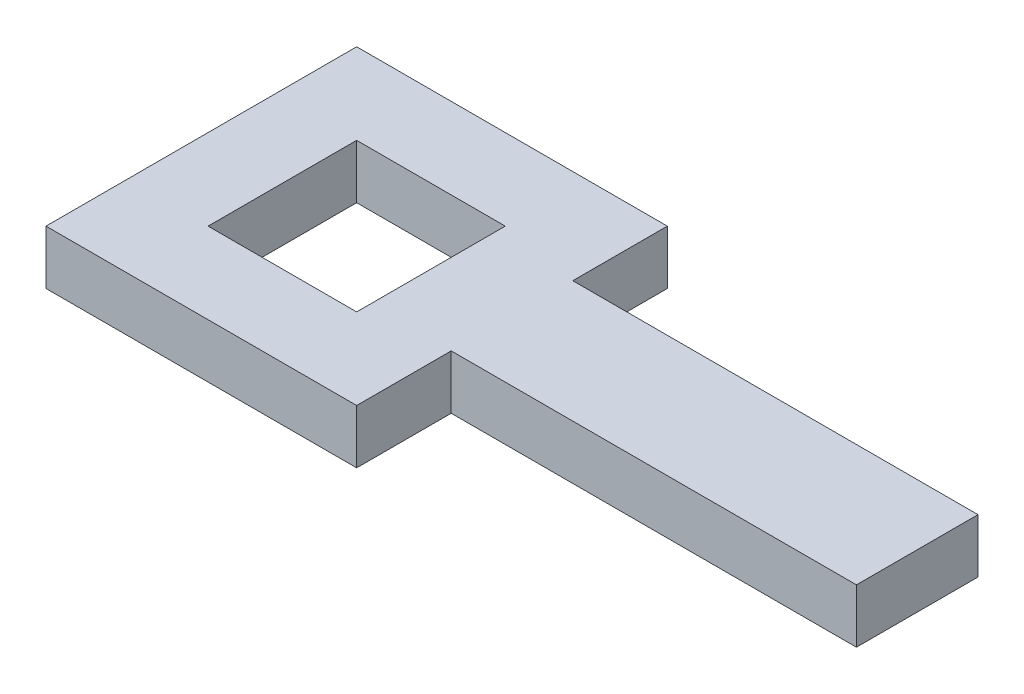
ISO-10303-21;
HEADER;
FILE_DESCRIPTION(('STEP AP214'),'2;1');
FILE_NAME('part.step','',(''),(''),'','','');
FILE_SCHEMA(('AUTOMOTIVE_DESIGN { 1 0 10303 214 1 1 1 1 }'));
ENDSEC;
DATA;
#1=APPLICATION_CONTEXT('core data for automotive mechanical design processes');
#2=APPLICATION_PROTOCOL_DEFINITION('international standard','automotive_design',2000,#1);
#3=PRODUCT_CONTEXT('',#1,'mechanical');
#4=PRODUCT('Part','Part','',(#3));
#5=PRODUCT_RELATED_PRODUCT_CATEGORY('part','',(#4));
#6=PRODUCT_DEFINITION_FORMATION('','',#4);
#7=PRODUCT_DEFINITION_CONTEXT('part definition',#1,'design');
#8=PRODUCT_DEFINITION('design','',#6,#7);
#9=PRODUCT_DEFINITION_SHAPE('','',#8);
#10=(LENGTH_UNIT() NAMED_UNIT(*) SI_UNIT(.MILLI.,.METRE.));
#11=(NAMED_UNIT(*) PLANE_ANGLE_UNIT() SI_UNIT($,.RADIAN.));
#12=(NAMED_UNIT(*) SI_UNIT($,.STERADIAN.) SOLID_ANGLE_UNIT());
#13=UNCERTAINTY_MEASURE_WITH_UNIT(LENGTH_MEASURE(1.E-05),#10,'distance_accuracy_value','');
#14=(GEOMETRIC_REPRESENTATION_CONTEXT(3) GLOBAL_UNCERTAINTY_ASSIGNED_CONTEXT((#13)) GLOBAL_UNIT_ASSIGNED_CONTEXT((#10,
#11,#12)) REPRESENTATION_CONTEXT('',''));
#15=CARTESIAN_POINT('',(0.,0.,0.));
#16=DIRECTION('',(0.,0.,1.));
#17=DIRECTION('',(1.,0.,0.));
#18=AXIS2_PLACEMENT_3D('',#15,#16,#17);
#19=CARTESIAN_POINT('',(11.1811881188119,4.,-11.7277227722772));
#20=DIRECTION('',(-1.,0.,0.));
#21=DIRECTION('',(0.,0.,1.));
#22=AXIS2_PLACEMENT_3D('',#19,#20,#21);
#23=PLANE('',#22);
#24=DIRECTION('',(0.,-1.,0.));
#25=VECTOR('',#24,1.);
#26=CARTESIAN_POINT('',(11.1811881188119,4.,4.27227722772277));
#27=LINE('',#26,#25);
#28=CARTESIAN_POINT('',(11.1811881188119,4.,4.27227722772277));
#29=VERTEX_POINT('',#28);
#30=CARTESIAN_POINT('',(11.1811881188119,0.,4.27227722772277));
#31=VERTEX_POINT('',#30);
#32=EDGE_CURVE('E61',#29,#31,#27,.T.);
#33=ORIENTED_EDGE('',*,*,#32,.F.);
#34=DIRECTION('',(0.,0.,-1.));
#35=VECTOR('',#34,1.);
#36=CARTESIAN_POINT('',(11.1811881188119,4.,-11.7277227722772));
#37=LINE('',#36,#35);
#38=CARTESIAN_POINT('',(11.1811881188119,4.,11.2722772277228));
#39=VERTEX_POINT('',#38);
#40=EDGE_CURVE('E222',#39,#29,#37,.T.);
#41=ORIENTED_EDGE('',*,*,#40,.F.);
#42=DIRECTION('',(0.,-1.,0.));
#43=VECTOR('',#42,1.);
#44=CARTESIAN_POINT('',(11.1811881188119,4.,11.2722772277228));
#45=LINE('',#44,#43);
#46=CARTESIAN_POINT('',(11.1811881188119,0.,11.2722772277228));
#47=VERTEX_POINT('',#46);
#48=EDGE_CURVE('E54',#39,#47,#45,.T.);
#49=ORIENTED_EDGE('',*,*,#48,.T.);
#50=DIRECTION('',(0.,0.,-1.));
#51=VECTOR('',#50,1.);
#52=CARTESIAN_POINT('',(11.1811881188119,0.,-11.7277227722772));
#53=LINE('',#52,#51);
#54=EDGE_CURVE('E236',#47,#31,#53,.T.);
#55=ORIENTED_EDGE('',*,*,#54,.T.);
#56=EDGE_LOOP('',(#33,#41,#49,#55));
#57=FACE_BOUND('',#56,.T.);
#58=ADVANCED_FACE('F45',(#57),#23,.F.);
#59=DIRECTION('',(0.,1.,0.));
#60=VECTOR('',#59,1.);
#61=CARTESIAN_POINT('',(11.1811881188119,4.,-4.72772277227723));
#62=LINE('',#61,#60);
#63=CARTESIAN_POINT('',(11.1811881188119,0.,-4.72772277227723));
#64=VERTEX_POINT('',#63);
#65=CARTESIAN_POINT('',(11.1811881188119,4.,-4.72772277227723));
#66=VERTEX_POINT('',#65);
#67=EDGE_CURVE('E69',#64,#66,#62,.T.);
#68=ORIENTED_EDGE('',*,*,#67,.F.);
#69=CARTESIAN_POINT('',(11.1811881188119,0.,-11.7277227722772));
#70=VERTEX_POINT('',#69);
#71=EDGE_CURVE('E235',#64,#70,#53,.T.);
#72=ORIENTED_EDGE('',*,*,#71,.T.);
#73=DIRECTION('',(0.,-1.,0.));
#74=VECTOR('',#73,1.);
#75=CARTESIAN_POINT('',(11.1811881188119,4.,-11.7277227722772));
#76=LINE('',#75,#74);
#77=CARTESIAN_POINT('',(11.1811881188119,4.,-11.7277227722772));
#78=VERTEX_POINT('',#77);
#79=EDGE_CURVE('E244',#78,#70,#76,.T.);
#80=ORIENTED_EDGE('',*,*,#79,.F.);
#81=EDGE_CURVE('E221',#66,#78,#37,.T.);
#82=ORIENTED_EDGE('',*,*,#81,.F.);
#83=EDGE_LOOP('',(#68,#72,#80,#82));
#84=FACE_BOUND('',#83,.T.);
#85=ADVANCED_FACE('F281',(#84),#23,.F.);
#86=CARTESIAN_POINT('',(-11.8188118811881,4.,-11.7277227722772));
#87=DIRECTION('',(1.,0.,0.));
#88=DIRECTION('',(0.,0.,-1.));
#89=AXIS2_PLACEMENT_3D('',#86,#87,#88);
#90=PLANE('',#89);
#91=DIRECTION('',(0.,0.,1.));
#92=VECTOR('',#91,1.);
#93=CARTESIAN_POINT('',(-11.8188118811881,0.,-11.7277227722772));
#94=LINE('',#93,#92);
#95=CARTESIAN_POINT('',(-11.8188118811881,0.,-11.7277227722772));
#96=VERTEX_POINT('',#95);
#97=CARTESIAN_POINT('',(-11.8188118811881,0.,11.2722772277228));
#98=VERTEX_POINT('',#97);
#99=EDGE_CURVE('E203',#96,#98,#94,.T.);
#100=ORIENTED_EDGE('',*,*,#99,.T.);
#101=DIRECTION('',(0.,-1.,0.));
#102=VECTOR('',#101,1.);
#103=CARTESIAN_POINT('',(-11.8188118811881,4.,11.2722772277228));
#104=LINE('',#103,#102);
#105=CARTESIAN_POINT('',(-11.8188118811881,4.,11.2722772277228));
#106=VERTEX_POINT('',#105);
#107=EDGE_CURVE('E11',#106,#98,#104,.T.);
#108=ORIENTED_EDGE('',*,*,#107,.F.);
#109=DIRECTION('',(0.,0.,1.));
#110=VECTOR('',#109,1.);
#111=CARTESIAN_POINT('',(-11.8188118811881,4.,-11.7277227722772));
#112=LINE('',#111,#110);
#113=CARTESIAN_POINT('',(-11.8188118811881,4.,-11.7277227722772));
#114=VERTEX_POINT('',#113);
#115=EDGE_CURVE('E213',#114,#106,#112,.T.);
#116=ORIENTED_EDGE('',*,*,#115,.F.);
#117=DIRECTION('',(0.,-1.,0.));
#118=VECTOR('',#117,1.);
#119=CARTESIAN_POINT('',(-11.8188118811881,4.,-11.7277227722772));
#120=LINE('',#119,#118);
#121=EDGE_CURVE('E228',#114,#96,#120,.T.);
#122=ORIENTED_EDGE('',*,*,#121,.T.);
#123=EDGE_LOOP('',(#100,#108,#116,#122));
#124=FACE_BOUND('',#123,.T.);
#125=ADVANCED_FACE('F47',(#124),#90,.F.);
#126=CARTESIAN_POINT('',(-11.8188118811881,4.,11.2722772277228));
#127=DIRECTION('',(0.,0.,-1.));
#128=DIRECTION('',(-1.,0.,0.));
#129=AXIS2_PLACEMENT_3D('',#126,#127,#128);
#130=PLANE('',#129);
#131=DIRECTION('',(1.,0.,0.));
#132=VECTOR('',#131,1.);
#133=CARTESIAN_POINT('',(-11.8188118811881,0.,11.2722772277228));
#134=LINE('',#133,#132);
#135=EDGE_CURVE('E232',#98,#47,#134,.T.);
#136=ORIENTED_EDGE('',*,*,#135,.T.);
#137=ORIENTED_EDGE('',*,*,#48,.F.);
#138=DIRECTION('',(1.,0.,0.));
#139=VECTOR('',#138,1.);
#140=CARTESIAN_POINT('',(-11.8188118811881,4.,11.2722772277228));
#141=LINE('',#140,#139);
#142=EDGE_CURVE('E217',#106,#39,#141,.T.);
#143=ORIENTED_EDGE('',*,*,#142,.F.);
#144=ORIENTED_EDGE('',*,*,#107,.T.);
#145=EDGE_LOOP('',(#136,#137,#143,#144));
#146=FACE_BOUND('',#145,.T.);
#147=ADVANCED_FACE('F253',(#146),#130,.F.);
#148=CARTESIAN_POINT('',(-11.8188118811881,4.,-11.7277227722772));
#149=DIRECTION('',(0.,0.,1.));
#150=DIRECTION('',(1.,0.,0.));
#151=AXIS2_PLACEMENT_3D('',#148,#149,#150);
#152=PLANE('',#151);
#153=DIRECTION('',(-1.,0.,0.));
#154=VECTOR('',#153,1.);
#155=CARTESIAN_POINT('',(-11.8188118811881,0.,-11.7277227722772));
#156=LINE('',#155,#154);
#157=EDGE_CURVE('E218',#70,#96,#156,.T.);
#158=ORIENTED_EDGE('',*,*,#157,.T.);
#159=ORIENTED_EDGE('',*,*,#121,.F.);
#160=DIRECTION('',(-1.,0.,0.));
#161=VECTOR('',#160,1.);
#162=CARTESIAN_POINT('',(-11.8188118811881,4.,-11.7277227722772));
#163=LINE('',#162,#161);
#164=EDGE_CURVE('E225',#78,#114,#163,.T.);
#165=ORIENTED_EDGE('',*,*,#164,.F.);
#166=ORIENTED_EDGE('',*,*,#79,.T.);
#167=EDGE_LOOP('',(#158,#159,#165,#166));
#168=FACE_BOUND('',#167,.T.);
#169=ADVANCED_FACE('F259',(#168),#152,.F.);
#170=CARTESIAN_POINT('',(0.,4.,0.));
#171=DIRECTION('',(0.,1.,0.));
#172=DIRECTION('',(0.,0.,1.));
#173=AXIS2_PLACEMENT_3D('',#170,#171,#172);
#174=PLANE('',#173);
#175=DIRECTION('',(0.,0.,1.));
#176=VECTOR('',#175,1.);
#177=CARTESIAN_POINT('',(-5.81881188118812,4.,-5.72772277227723));
#178=LINE('',#177,#176);
#179=CARTESIAN_POINT('',(-5.81881188118812,4.,-5.72772277227723));
#180=VERTEX_POINT('',#179);
#181=CARTESIAN_POINT('',(-5.81881188118812,4.,5.27227722772277));
#182=VERTEX_POINT('',#181);
#183=EDGE_CURVE('E162',#180,#182,#178,.T.);
#184=ORIENTED_EDGE('',*,*,#183,.F.);
#185=DIRECTION('',(-1.,0.,0.));
#186=VECTOR('',#185,1.);
#187=CARTESIAN_POINT('',(-5.81881188118812,4.,-5.72772277227723));
#188=LINE('',#187,#186);
#189=CARTESIAN_POINT('',(5.18118811881189,4.,-5.72772277227723));
#190=VERTEX_POINT('',#189);
#191=EDGE_CURVE('E177',#190,#180,#188,.T.);
#192=ORIENTED_EDGE('',*,*,#191,.F.);
#193=DIRECTION('',(0.,0.,-1.));
#194=VECTOR('',#193,1.);
#195=CARTESIAN_POINT('',(5.18118811881189,4.,-5.72772277227723));
#196=LINE('',#195,#194);
#197=CARTESIAN_POINT('',(5.18118811881189,4.,5.27227722772277));
#198=VERTEX_POINT('',#197);
#199=EDGE_CURVE('E193',#198,#190,#196,.T.);
#200=ORIENTED_EDGE('',*,*,#199,.F.);
#201=DIRECTION('',(1.,0.,0.));
#202=VECTOR('',#201,1.);
#203=CARTESIAN_POINT('',(-5.81881188118812,4.,5.27227722772277));
#204=LINE('',#203,#202);
#205=EDGE_CURVE('E166',#182,#198,#204,.T.);
#206=ORIENTED_EDGE('',*,*,#205,.F.);
#207=EDGE_LOOP('',(#184,#192,#200,#206));
#208=FACE_BOUND('',#207,.T.);
#209=ORIENTED_EDGE('',*,*,#115,.T.);
#210=ORIENTED_EDGE('',*,*,#142,.T.);
#211=ORIENTED_EDGE('',*,*,#40,.T.);
#212=DIRECTION('',(-1.,0.,0.));
#213=VECTOR('',#212,1.);
#214=CARTESIAN_POINT('',(41.1811881188119,4.,4.27227722772276));
#215=LINE('',#214,#213);
#216=CARTESIAN_POINT('',(41.1811881188119,4.,4.27227722772276));
#217=VERTEX_POINT('',#216);
#218=EDGE_CURVE('E269',#217,#29,#215,.T.);
#219=ORIENTED_EDGE('',*,*,#218,.F.);
#220=DIRECTION('',(0.,0.,1.));
#221=VECTOR('',#220,1.);
#222=CARTESIAN_POINT('',(41.1811881188119,4.,4.27227722772276));
#223=LINE('',#222,#221);
#224=CARTESIAN_POINT('',(41.1811881188119,4.,-4.72772277227724));
#225=VERTEX_POINT('',#224);
#226=EDGE_CURVE('E154',#225,#217,#223,.T.);
#227=ORIENTED_EDGE('',*,*,#226,.F.);
#228=DIRECTION('',(-1.,0.,0.));
#229=VECTOR('',#228,1.);
#230=CARTESIAN_POINT('',(41.1811881188119,4.,-4.72772277227724));
#231=LINE('',#230,#229);
#232=EDGE_CURVE('E168',#225,#66,#231,.T.);
#233=ORIENTED_EDGE('',*,*,#232,.T.);
#234=ORIENTED_EDGE('',*,*,#81,.T.);
#235=ORIENTED_EDGE('',*,*,#164,.T.);
#236=EDGE_LOOP('',(#209,#210,#211,#219,#227,#233,#234,#235));
#237=FACE_BOUND('',#236,.T.);
#238=ADVANCED_FACE('F279',(#208,#237),#174,.T.);
#239=CARTESIAN_POINT('',(0.,0.,0.));
#240=DIRECTION('',(0.,1.,0.));
#241=DIRECTION('',(0.,0.,1.));
#242=AXIS2_PLACEMENT_3D('',#239,#240,#241);
#243=PLANE('',#242);
#244=DIRECTION('',(-1.,0.,0.));
#245=VECTOR('',#244,1.);
#246=CARTESIAN_POINT('',(-5.81881188118812,0.,-5.72772277227723));
#247=LINE('',#246,#245);
#248=CARTESIAN_POINT('',(5.18118811881189,0.,-5.72772277227723));
#249=VERTEX_POINT('',#248);
#250=CARTESIAN_POINT('',(-5.81881188118812,0.,-5.72772277227723));
#251=VERTEX_POINT('',#250);
#252=EDGE_CURVE('E185',#249,#251,#247,.T.);
#253=ORIENTED_EDGE('',*,*,#252,.T.);
#254=DIRECTION('',(0.,0.,1.));
#255=VECTOR('',#254,1.);
#256=CARTESIAN_POINT('',(-5.81881188118812,0.,-5.72772277227723));
#257=LINE('',#256,#255);
#258=CARTESIAN_POINT('',(-5.81881188118812,0.,5.27227722772277));
#259=VERTEX_POINT('',#258);
#260=EDGE_CURVE('E172',#251,#259,#257,.T.);
#261=ORIENTED_EDGE('',*,*,#260,.T.);
#262=DIRECTION('',(1.,0.,0.));
#263=VECTOR('',#262,1.);
#264=CARTESIAN_POINT('',(-5.81881188118812,0.,5.27227722772277));
#265=LINE('',#264,#263);
#266=CARTESIAN_POINT('',(5.18118811881189,0.,5.27227722772277));
#267=VERTEX_POINT('',#266);
#268=EDGE_CURVE('E176',#259,#267,#265,.T.);
#269=ORIENTED_EDGE('',*,*,#268,.T.);
#270=DIRECTION('',(0.,0.,-1.));
#271=VECTOR('',#270,1.);
#272=CARTESIAN_POINT('',(5.18118811881189,0.,-5.72772277227723));
#273=LINE('',#272,#271);
#274=EDGE_CURVE('E181',#267,#249,#273,.T.);
#275=ORIENTED_EDGE('',*,*,#274,.T.);
#276=EDGE_LOOP('',(#253,#261,#269,#275));
#277=FACE_BOUND('',#276,.T.);
#278=ORIENTED_EDGE('',*,*,#99,.F.);
#279=ORIENTED_EDGE('',*,*,#157,.F.);
#280=ORIENTED_EDGE('',*,*,#71,.F.);
#281=DIRECTION('',(-1.,0.,0.));
#282=VECTOR('',#281,1.);
#283=CARTESIAN_POINT('',(41.1811881188119,0.,-4.72772277227724));
#284=LINE('',#283,#282);
#285=CARTESIAN_POINT('',(41.1811881188119,0.,-4.72772277227724));
#286=VERTEX_POINT('',#285);
#287=EDGE_CURVE('E144',#286,#64,#284,.T.);
#288=ORIENTED_EDGE('',*,*,#287,.F.);
#289=DIRECTION('',(0.,0.,-1.));
#290=VECTOR('',#289,1.);
#291=CARTESIAN_POINT('',(41.1811881188119,0.,4.27227722772276));
#292=LINE('',#291,#290);
#293=CARTESIAN_POINT('',(41.1811881188119,0.,4.27227722772276));
#294=VERTEX_POINT('',#293);
#295=EDGE_CURVE('E136',#294,#286,#292,.T.);
#296=ORIENTED_EDGE('',*,*,#295,.F.);
#297=DIRECTION('',(-1.,0.,0.));
#298=VECTOR('',#297,1.);
#299=CARTESIAN_POINT('',(41.1811881188119,0.,4.27227722772276));
#300=LINE('',#299,#298);
#301=EDGE_CURVE('E142',#294,#31,#300,.T.);
#302=ORIENTED_EDGE('',*,*,#301,.T.);
#303=ORIENTED_EDGE('',*,*,#54,.F.);
#304=ORIENTED_EDGE('',*,*,#135,.F.);
#305=EDGE_LOOP('',(#278,#279,#280,#288,#296,#302,#303,#304));
#306=FACE_BOUND('',#305,.T.);
#307=ADVANCED_FACE('F139',(#277,#306),#243,.F.);
#308=CARTESIAN_POINT('',(-5.81881188118812,0.,-5.72772277227723));
#309=DIRECTION('',(-1.,0.,0.));
#310=DIRECTION('',(0.,0.,1.));
#311=AXIS2_PLACEMENT_3D('',#308,#309,#310);
#312=PLANE('',#311);
#313=ORIENTED_EDGE('',*,*,#183,.T.);
#314=DIRECTION('',(0.,1.,0.));
#315=VECTOR('',#314,1.);
#316=CARTESIAN_POINT('',(-5.81881188118812,0.,5.27227722772277));
#317=LINE('',#316,#315);
#318=EDGE_CURVE('E188',#259,#182,#317,.T.);
#319=ORIENTED_EDGE('',*,*,#318,.F.);
#320=ORIENTED_EDGE('',*,*,#260,.F.);
#321=DIRECTION('',(0.,1.,0.));
#322=VECTOR('',#321,1.);
#323=CARTESIAN_POINT('',(-5.81881188118812,0.,-5.72772277227723));
#324=LINE('',#323,#322);
#325=EDGE_CURVE('E200',#251,#180,#324,.T.);
#326=ORIENTED_EDGE('',*,*,#325,.T.);
#327=EDGE_LOOP('',(#313,#319,#320,#326));
#328=FACE_BOUND('',#327,.T.);
#329=ADVANCED_FACE('F303',(#328),#312,.F.);
#330=CARTESIAN_POINT('',(-5.81881188118812,0.,-5.72772277227723));
#331=DIRECTION('',(0.,0.,-1.));
#332=DIRECTION('',(-1.,0.,0.));
#333=AXIS2_PLACEMENT_3D('',#330,#331,#332);
#334=PLANE('',#333);
#335=ORIENTED_EDGE('',*,*,#191,.T.);
#336=ORIENTED_EDGE('',*,*,#325,.F.);
#337=ORIENTED_EDGE('',*,*,#252,.F.);
#338=DIRECTION('',(0.,1.,0.));
#339=VECTOR('',#338,1.);
#340=CARTESIAN_POINT('',(5.18118811881189,0.,-5.72772277227723));
#341=LINE('',#340,#339);
#342=EDGE_CURVE('E204',#249,#190,#341,.T.);
#343=ORIENTED_EDGE('',*,*,#342,.T.);
#344=EDGE_LOOP('',(#335,#336,#337,#343));
#345=FACE_BOUND('',#344,.T.);
#346=ADVANCED_FACE('F308',(#345),#334,.F.);
#347=CARTESIAN_POINT('',(5.18118811881189,0.,-5.72772277227723));
#348=DIRECTION('',(1.,0.,0.));
#349=DIRECTION('',(0.,0.,-1.));
#350=AXIS2_PLACEMENT_3D('',#347,#348,#349);
#351=PLANE('',#350);
#352=ORIENTED_EDGE('',*,*,#199,.T.);
#353=ORIENTED_EDGE('',*,*,#342,.F.);
#354=ORIENTED_EDGE('',*,*,#274,.F.);
#355=DIRECTION('',(0.,1.,0.));
#356=VECTOR('',#355,1.);
#357=CARTESIAN_POINT('',(5.18118811881189,0.,5.27227722772277));
#358=LINE('',#357,#356);
#359=EDGE_CURVE('E207',#267,#198,#358,.T.);
#360=ORIENTED_EDGE('',*,*,#359,.T.);
#361=EDGE_LOOP('',(#352,#353,#354,#360));
#362=FACE_BOUND('',#361,.T.);
#363=ADVANCED_FACE('F313',(#362),#351,.F.);
#364=CARTESIAN_POINT('',(-5.81881188118812,0.,5.27227722772277));
#365=DIRECTION('',(0.,0.,1.));
#366=DIRECTION('',(1.,0.,0.));
#367=AXIS2_PLACEMENT_3D('',#364,#365,#366);
#368=PLANE('',#367);
#369=ORIENTED_EDGE('',*,*,#205,.T.);
#370=ORIENTED_EDGE('',*,*,#359,.F.);
#371=ORIENTED_EDGE('',*,*,#268,.F.);
#372=ORIENTED_EDGE('',*,*,#318,.T.);
#373=EDGE_LOOP('',(#369,#370,#371,#372));
#374=FACE_BOUND('',#373,.T.);
#375=ADVANCED_FACE('F310',(#374),#368,.F.);
#376=CARTESIAN_POINT('',(41.1811881188119,4.,4.27227722772276));
#377=DIRECTION('',(0.,0.,-1.));
#378=DIRECTION('',(-1.,0.,0.));
#379=AXIS2_PLACEMENT_3D('',#376,#377,#378);
#380=PLANE('',#379);
#381=ORIENTED_EDGE('',*,*,#32,.T.);
#382=ORIENTED_EDGE('',*,*,#301,.F.);
#383=DIRECTION('',(0.,-1.,0.));
#384=VECTOR('',#383,1.);
#385=CARTESIAN_POINT('',(41.1811881188119,4.,4.27227722772276));
#386=LINE('',#385,#384);
#387=EDGE_CURVE('E149',#217,#294,#386,.T.);
#388=ORIENTED_EDGE('',*,*,#387,.F.);
#389=ORIENTED_EDGE('',*,*,#218,.T.);
#390=EDGE_LOOP('',(#381,#382,#388,#389));
#391=FACE_BOUND('',#390,.T.);
#392=ADVANCED_FACE('F160',(#391),#380,.F.);
#393=CARTESIAN_POINT('',(41.1811881188119,4.,-4.72772277227724));
#394=DIRECTION('',(0.,0.,1.));
#395=DIRECTION('',(1.,0.,0.));
#396=AXIS2_PLACEMENT_3D('',#393,#394,#395);
#397=PLANE('',#396);
#398=ORIENTED_EDGE('',*,*,#67,.T.);
#399=ORIENTED_EDGE('',*,*,#232,.F.);
#400=DIRECTION('',(0.,1.,0.));
#401=VECTOR('',#400,1.);
#402=CARTESIAN_POINT('',(41.1811881188119,4.,-4.72772277227724));
#403=LINE('',#402,#401);
#404=EDGE_CURVE('E148',#286,#225,#403,.T.);
#405=ORIENTED_EDGE('',*,*,#404,.F.);
#406=ORIENTED_EDGE('',*,*,#287,.T.);
#407=EDGE_LOOP('',(#398,#399,#405,#406));
#408=FACE_BOUND('',#407,.T.);
#409=ADVANCED_FACE('F263',(#408),#397,.F.);
#410=CARTESIAN_POINT('',(41.1811881188119,0.,0.));
#411=DIRECTION('',(1.,0.,0.));
#412=DIRECTION('',(0.,0.,-1.));
#413=AXIS2_PLACEMENT_3D('',#410,#411,#412);
#414=PLANE('',#413);
#415=ORIENTED_EDGE('',*,*,#387,.T.);
#416=ORIENTED_EDGE('',*,*,#295,.T.);
#417=ORIENTED_EDGE('',*,*,#404,.T.);
#418=ORIENTED_EDGE('',*,*,#226,.T.);
#419=EDGE_LOOP('',(#415,#416,#417,#418));
#420=FACE_BOUND('',#419,.T.);
#421=ADVANCED_FACE('F152',(#420),#414,.T.);
#422=CLOSED_SHELL('',(#58,#85,#125,#147,#169,#238,#307,#329,#346,#363,#375,#392,#409,#421));
#423=MANIFOLD_SOLID_BREP('B2',#422);
#424=ADVANCED_BREP_SHAPE_REPRESENTATION('',(#18,#423),#14);
#425=SHAPE_DEFINITION_REPRESENTATION(#9,#424);
ENDSEC;
END-ISO-10303-21;
